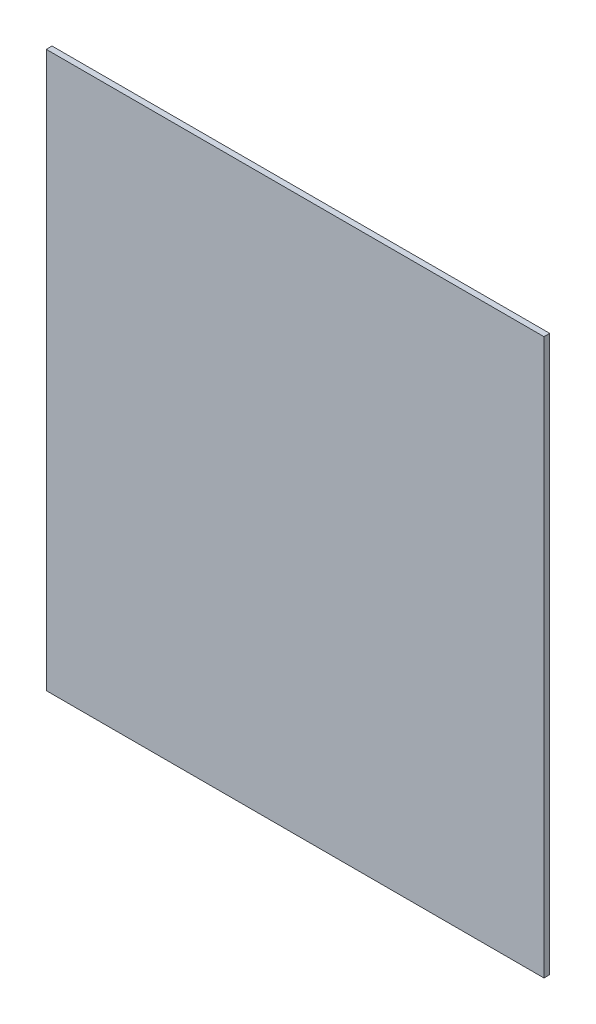
ISO-10303-21;
HEADER;
FILE_DESCRIPTION(('STEP AP214'),'2;1');
FILE_NAME('part.step','',(''),(''),'','','');
FILE_SCHEMA(('AUTOMOTIVE_DESIGN { 1 0 10303 214 1 1 1 1 }'));
ENDSEC;
DATA;
#1=APPLICATION_CONTEXT('core data for automotive mechanical design processes');
#2=APPLICATION_PROTOCOL_DEFINITION('international standard','automotive_design',2000,#1);
#3=PRODUCT_CONTEXT('',#1,'mechanical');
#4=PRODUCT('Part','Part','',(#3));
#5=PRODUCT_RELATED_PRODUCT_CATEGORY('part','',(#4));
#6=PRODUCT_DEFINITION_FORMATION('','',#4);
#7=PRODUCT_DEFINITION_CONTEXT('part definition',#1,'design');
#8=PRODUCT_DEFINITION('design','',#6,#7);
#9=PRODUCT_DEFINITION_SHAPE('','',#8);
#10=(LENGTH_UNIT() NAMED_UNIT(*) SI_UNIT(.MILLI.,.METRE.));
#11=(NAMED_UNIT(*) PLANE_ANGLE_UNIT() SI_UNIT($,.RADIAN.));
#12=(NAMED_UNIT(*) SI_UNIT($,.STERADIAN.) SOLID_ANGLE_UNIT());
#13=UNCERTAINTY_MEASURE_WITH_UNIT(LENGTH_MEASURE(1.E-05),#10,'distance_accuracy_value','');
#14=(GEOMETRIC_REPRESENTATION_CONTEXT(3) GLOBAL_UNCERTAINTY_ASSIGNED_CONTEXT((#13)) GLOBAL_UNIT_ASSIGNED_CONTEXT((#10,
#11,#12)) REPRESENTATION_CONTEXT('',''));
#15=CARTESIAN_POINT('',(0.,0.,0.));
#16=DIRECTION('',(0.,0.,1.));
#17=DIRECTION('',(1.,0.,0.));
#18=AXIS2_PLACEMENT_3D('',#15,#16,#17);
#19=CARTESIAN_POINT('',(-34.5,-38.5,0.8));
#20=DIRECTION('',(1.,0.,0.));
#21=DIRECTION('',(0.,0.,-1.));
#22=AXIS2_PLACEMENT_3D('',#19,#20,#21);
#23=PLANE('',#22);
#24=DIRECTION('',(0.,-1.,0.));
#25=VECTOR('',#24,1.);
#26=CARTESIAN_POINT('',(-34.5,-38.5,0.));
#27=LINE('',#26,#25);
#28=CARTESIAN_POINT('',(-34.5,38.5,0.));
#29=VERTEX_POINT('',#28);
#30=CARTESIAN_POINT('',(-34.5,-38.5,0.));
#31=VERTEX_POINT('',#30);
#32=EDGE_CURVE('E109',#29,#31,#27,.T.);
#33=ORIENTED_EDGE('',*,*,#32,.T.);
#34=DIRECTION('',(0.,0.,-1.));
#35=VECTOR('',#34,1.);
#36=CARTESIAN_POINT('',(-34.5,-38.5,0.8));
#37=LINE('',#36,#35);
#38=CARTESIAN_POINT('',(-34.5,-38.5,0.8));
#39=VERTEX_POINT('',#38);
#40=EDGE_CURVE('E11',#39,#31,#37,.T.);
#41=ORIENTED_EDGE('',*,*,#40,.F.);
#42=DIRECTION('',(0.,-1.,0.));
#43=VECTOR('',#42,1.);
#44=CARTESIAN_POINT('',(-34.5,-38.5,0.8));
#45=LINE('',#44,#43);
#46=CARTESIAN_POINT('',(-34.5,38.5,0.8));
#47=VERTEX_POINT('',#46);
#48=EDGE_CURVE('E93',#47,#39,#45,.T.);
#49=ORIENTED_EDGE('',*,*,#48,.F.);
#50=DIRECTION('',(0.,0.,-1.));
#51=VECTOR('',#50,1.);
#52=CARTESIAN_POINT('',(-34.5,38.5,0.8));
#53=LINE('',#52,#51);
#54=EDGE_CURVE('E105',#47,#29,#53,.T.);
#55=ORIENTED_EDGE('',*,*,#54,.T.);
#56=EDGE_LOOP('',(#33,#41,#49,#55));
#57=FACE_BOUND('',#56,.T.);
#58=ADVANCED_FACE('F41',(#57),#23,.F.);
#59=CARTESIAN_POINT('',(34.5,-38.5,0.8));
#60=DIRECTION('',(0.,1.,0.));
#61=DIRECTION('',(-1.,0.,0.));
#62=AXIS2_PLACEMENT_3D('',#59,#60,#61);
#63=PLANE('',#62);
#64=DIRECTION('',(1.,0.,0.));
#65=VECTOR('',#64,1.);
#66=CARTESIAN_POINT('',(34.5,-38.5,0.));
#67=LINE('',#66,#65);
#68=CARTESIAN_POINT('',(34.5,-38.5,0.));
#69=VERTEX_POINT('',#68);
#70=EDGE_CURVE('E98',#31,#69,#67,.T.);
#71=ORIENTED_EDGE('',*,*,#70,.T.);
#72=DIRECTION('',(0.,0.,-1.));
#73=VECTOR('',#72,1.);
#74=CARTESIAN_POINT('',(34.5,-38.5,0.8));
#75=LINE('',#74,#73);
#76=CARTESIAN_POINT('',(34.5,-38.5,0.8));
#77=VERTEX_POINT('',#76);
#78=EDGE_CURVE('E50',#77,#69,#75,.T.);
#79=ORIENTED_EDGE('',*,*,#78,.F.);
#80=DIRECTION('',(1.,0.,0.));
#81=VECTOR('',#80,1.);
#82=CARTESIAN_POINT('',(34.5,-38.5,0.8));
#83=LINE('',#82,#81);
#84=EDGE_CURVE('E88',#39,#77,#83,.T.);
#85=ORIENTED_EDGE('',*,*,#84,.F.);
#86=ORIENTED_EDGE('',*,*,#40,.T.);
#87=EDGE_LOOP('',(#71,#79,#85,#86));
#88=FACE_BOUND('',#87,.T.);
#89=ADVANCED_FACE('F97',(#88),#63,.F.);
#90=CARTESIAN_POINT('',(34.5,-38.5,0.8));
#91=DIRECTION('',(-1.,0.,0.));
#92=DIRECTION('',(0.,0.,1.));
#93=AXIS2_PLACEMENT_3D('',#90,#91,#92);
#94=PLANE('',#93);
#95=DIRECTION('',(0.,1.,0.));
#96=VECTOR('',#95,1.);
#97=CARTESIAN_POINT('',(34.5,-38.5,0.));
#98=LINE('',#97,#96);
#99=CARTESIAN_POINT('',(34.5,38.5,0.));
#100=VERTEX_POINT('',#99);
#101=EDGE_CURVE('E75',#69,#100,#98,.T.);
#102=ORIENTED_EDGE('',*,*,#101,.T.);
#103=DIRECTION('',(0.,0.,-1.));
#104=VECTOR('',#103,1.);
#105=CARTESIAN_POINT('',(34.5,38.5,0.8));
#106=LINE('',#105,#104);
#107=CARTESIAN_POINT('',(34.5,38.5,0.8));
#108=VERTEX_POINT('',#107);
#109=EDGE_CURVE('E100',#108,#100,#106,.T.);
#110=ORIENTED_EDGE('',*,*,#109,.F.);
#111=DIRECTION('',(0.,1.,0.));
#112=VECTOR('',#111,1.);
#113=CARTESIAN_POINT('',(34.5,-38.5,0.8));
#114=LINE('',#113,#112);
#115=EDGE_CURVE('E91',#77,#108,#114,.T.);
#116=ORIENTED_EDGE('',*,*,#115,.F.);
#117=ORIENTED_EDGE('',*,*,#78,.T.);
#118=EDGE_LOOP('',(#102,#110,#116,#117));
#119=FACE_BOUND('',#118,.T.);
#120=ADVANCED_FACE('F101',(#119),#94,.F.);
#121=CARTESIAN_POINT('',(34.5,38.5,0.8));
#122=DIRECTION('',(0.,-1.,0.));
#123=DIRECTION('',(1.,0.,0.));
#124=AXIS2_PLACEMENT_3D('',#121,#122,#123);
#125=PLANE('',#124);
#126=DIRECTION('',(-1.,0.,0.));
#127=VECTOR('',#126,1.);
#128=CARTESIAN_POINT('',(34.5,38.5,0.));
#129=LINE('',#128,#127);
#130=EDGE_CURVE('E81',#100,#29,#129,.T.);
#131=ORIENTED_EDGE('',*,*,#130,.T.);
#132=ORIENTED_EDGE('',*,*,#54,.F.);
#133=DIRECTION('',(-1.,0.,0.));
#134=VECTOR('',#133,1.);
#135=CARTESIAN_POINT('',(34.5,38.5,0.8));
#136=LINE('',#135,#134);
#137=EDGE_CURVE('E58',#108,#47,#136,.T.);
#138=ORIENTED_EDGE('',*,*,#137,.F.);
#139=ORIENTED_EDGE('',*,*,#109,.T.);
#140=EDGE_LOOP('',(#131,#132,#138,#139));
#141=FACE_BOUND('',#140,.T.);
#142=ADVANCED_FACE('F122',(#141),#125,.F.);
#143=CARTESIAN_POINT('',(0.,0.,0.8));
#144=DIRECTION('',(0.,0.,1.));
#145=DIRECTION('',(1.,0.,0.));
#146=AXIS2_PLACEMENT_3D('',#143,#144,#145);
#147=PLANE('',#146);
#148=ORIENTED_EDGE('',*,*,#48,.T.);
#149=ORIENTED_EDGE('',*,*,#84,.T.);
#150=ORIENTED_EDGE('',*,*,#115,.T.);
#151=ORIENTED_EDGE('',*,*,#137,.T.);
#152=EDGE_LOOP('',(#148,#149,#150,#151));
#153=FACE_BOUND('',#152,.T.);
#154=ADVANCED_FACE('F89',(#153),#147,.T.);
#155=CARTESIAN_POINT('',(0.,0.,0.));
#156=DIRECTION('',(0.,0.,1.));
#157=DIRECTION('',(1.,0.,0.));
#158=AXIS2_PLACEMENT_3D('',#155,#156,#157);
#159=PLANE('',#158);
#160=ORIENTED_EDGE('',*,*,#32,.F.);
#161=ORIENTED_EDGE('',*,*,#130,.F.);
#162=ORIENTED_EDGE('',*,*,#101,.F.);
#163=ORIENTED_EDGE('',*,*,#70,.F.);
#164=EDGE_LOOP('',(#160,#161,#162,#163));
#165=FACE_BOUND('',#164,.T.);
#166=ADVANCED_FACE('F125',(#165),#159,.F.);
#167=CLOSED_SHELL('',(#58,#89,#120,#142,#154,#166));
#168=MANIFOLD_SOLID_BREP('B2',#167);
#169=ADVANCED_BREP_SHAPE_REPRESENTATION('',(#18,#168),#14);
#170=SHAPE_DEFINITION_REPRESENTATION(#9,#169);
ENDSEC;
END-ISO-10303-21;
